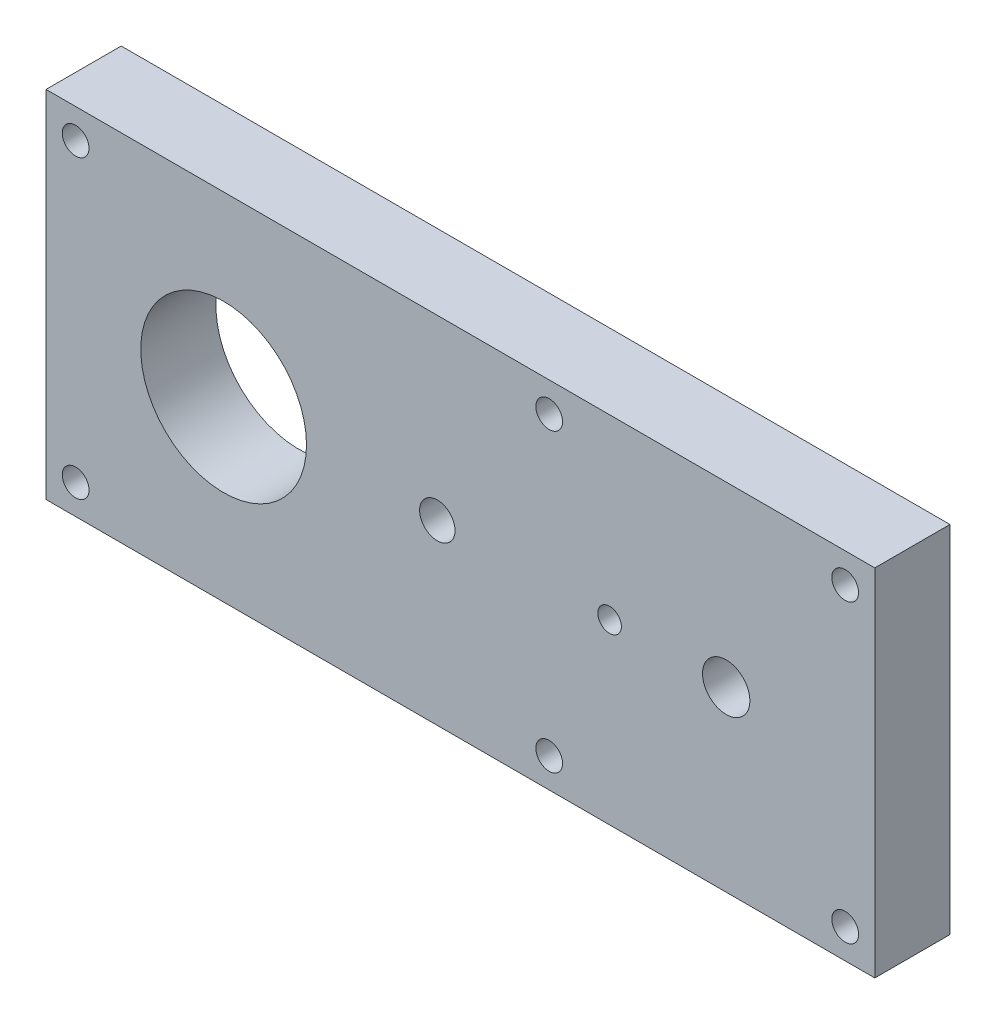
ISO-10303-21;
HEADER;
FILE_DESCRIPTION(('STEP AP214'),'2;1');
FILE_NAME('part.step','',(''),(''),'','','');
FILE_SCHEMA(('AUTOMOTIVE_DESIGN { 1 0 10303 214 1 1 1 1 }'));
ENDSEC;
DATA;
#1=APPLICATION_CONTEXT('core data for automotive mechanical design processes');
#2=APPLICATION_PROTOCOL_DEFINITION('international standard','automotive_design',2000,#1);
#3=PRODUCT_CONTEXT('',#1,'mechanical');
#4=PRODUCT('Part','Part','',(#3));
#5=PRODUCT_RELATED_PRODUCT_CATEGORY('part','',(#4));
#6=PRODUCT_DEFINITION_FORMATION('','',#4);
#7=PRODUCT_DEFINITION_CONTEXT('part definition',#1,'design');
#8=PRODUCT_DEFINITION('design','',#6,#7);
#9=PRODUCT_DEFINITION_SHAPE('','',#8);
#10=(LENGTH_UNIT() NAMED_UNIT(*) SI_UNIT(.MILLI.,.METRE.));
#11=(NAMED_UNIT(*) PLANE_ANGLE_UNIT() SI_UNIT($,.RADIAN.));
#12=(NAMED_UNIT(*) SI_UNIT($,.STERADIAN.) SOLID_ANGLE_UNIT());
#13=UNCERTAINTY_MEASURE_WITH_UNIT(LENGTH_MEASURE(1.E-05),#10,'distance_accuracy_value','');
#14=(GEOMETRIC_REPRESENTATION_CONTEXT(3) GLOBAL_UNCERTAINTY_ASSIGNED_CONTEXT((#13)) GLOBAL_UNIT_ASSIGNED_CONTEXT((#10,
#11,#12)) REPRESENTATION_CONTEXT('',''));
#15=CARTESIAN_POINT('',(0.,0.,0.));
#16=DIRECTION('',(0.,0.,1.));
#17=DIRECTION('',(1.,0.,0.));
#18=AXIS2_PLACEMENT_3D('',#15,#16,#17);
#19=CARTESIAN_POINT('',(0.,0.,6.35));
#20=DIRECTION('',(0.,0.,1.));
#21=DIRECTION('',(1.,0.,0.));
#22=AXIS2_PLACEMENT_3D('',#19,#20,#21);
#23=PLANE('',#22);
#24=CARTESIAN_POINT('',(-12.5,12.5,6.35));
#25=DIRECTION('',(0.,0.,1.));
#26=DIRECTION('',(1.,0.,0.));
#27=AXIS2_PLACEMENT_3D('',#24,#25,#26);
#28=CIRCLE('',#27,1.1303);
#29=CARTESIAN_POINT('',(-11.3697,12.5,6.35));
#30=VERTEX_POINT('',#29);
#31=EDGE_CURVE('E171',#30,#30,#28,.T.);
#32=ORIENTED_EDGE('',*,*,#31,.F.);
#33=EDGE_LOOP('',(#32));
#34=FACE_BOUND('',#33,.T.);
#35=CARTESIAN_POINT('',(-12.5,-12.5,6.35));
#36=DIRECTION('',(0.,0.,1.));
#37=DIRECTION('',(1.,0.,0.));
#38=AXIS2_PLACEMENT_3D('',#35,#36,#37);
#39=CIRCLE('',#38,1.1303);
#40=CARTESIAN_POINT('',(-11.3697,-12.5,6.35));
#41=VERTEX_POINT('',#40);
#42=EDGE_CURVE('E165',#41,#41,#39,.T.);
#43=ORIENTED_EDGE('',*,*,#42,.F.);
#44=EDGE_LOOP('',(#43));
#45=FACE_BOUND('',#44,.T.);
#46=CARTESIAN_POINT('',(27.5,12.5,6.35));
#47=DIRECTION('',(0.,0.,1.));
#48=DIRECTION('',(1.,0.,0.));
#49=AXIS2_PLACEMENT_3D('',#46,#47,#48);
#50=CIRCLE('',#49,1.1303);
#51=CARTESIAN_POINT('',(28.6303,12.5,6.35));
#52=VERTEX_POINT('',#51);
#53=EDGE_CURVE('E159',#52,#52,#50,.T.);
#54=ORIENTED_EDGE('',*,*,#53,.F.);
#55=EDGE_LOOP('',(#54));
#56=FACE_BOUND('',#55,.T.);
#57=CARTESIAN_POINT('',(27.5,-12.5,6.35));
#58=DIRECTION('',(0.,0.,1.));
#59=DIRECTION('',(1.,0.,0.));
#60=AXIS2_PLACEMENT_3D('',#57,#58,#59);
#61=CIRCLE('',#60,1.1303);
#62=CARTESIAN_POINT('',(28.6303,-12.5,6.35));
#63=VERTEX_POINT('',#62);
#64=EDGE_CURVE('E153',#63,#63,#61,.T.);
#65=ORIENTED_EDGE('',*,*,#64,.F.);
#66=EDGE_LOOP('',(#65));
#67=FACE_BOUND('',#66,.T.);
#68=CARTESIAN_POINT('',(52.5,12.5,6.35));
#69=DIRECTION('',(0.,0.,1.));
#70=DIRECTION('',(1.,0.,0.));
#71=AXIS2_PLACEMENT_3D('',#68,#69,#70);
#72=CIRCLE('',#71,1.1303);
#73=CARTESIAN_POINT('',(53.6303,12.5,6.35));
#74=VERTEX_POINT('',#73);
#75=EDGE_CURVE('E147',#74,#74,#72,.T.);
#76=ORIENTED_EDGE('',*,*,#75,.F.);
#77=EDGE_LOOP('',(#76));
#78=FACE_BOUND('',#77,.T.);
#79=CARTESIAN_POINT('',(52.5,-12.5,6.35));
#80=DIRECTION('',(0.,0.,1.));
#81=DIRECTION('',(1.,0.,0.));
#82=AXIS2_PLACEMENT_3D('',#79,#80,#81);
#83=CIRCLE('',#82,1.1303);
#84=CARTESIAN_POINT('',(53.6303,-12.5,6.35));
#85=VERTEX_POINT('',#84);
#86=EDGE_CURVE('E141',#85,#85,#83,.T.);
#87=ORIENTED_EDGE('',*,*,#86,.F.);
#88=EDGE_LOOP('',(#87));
#89=FACE_BOUND('',#88,.T.);
#90=CARTESIAN_POINT('',(32.6,0.,6.35));
#91=DIRECTION('',(0.,0.,1.));
#92=DIRECTION('',(1.,0.,0.));
#93=AXIS2_PLACEMENT_3D('',#90,#91,#92);
#94=CIRCLE('',#93,0.995);
#95=CARTESIAN_POINT('',(33.595,0.,6.35));
#96=VERTEX_POINT('',#95);
#97=EDGE_CURVE('E124',#96,#96,#94,.T.);
#98=ORIENTED_EDGE('',*,*,#97,.F.);
#99=EDGE_LOOP('',(#98));
#100=FACE_BOUND('',#99,.T.);
#101=CARTESIAN_POINT('',(0.,0.,6.35));
#102=DIRECTION('',(0.,0.,1.));
#103=DIRECTION('',(1.,0.,0.));
#104=AXIS2_PLACEMENT_3D('',#101,#102,#103);
#105=CIRCLE('',#104,7.);
#106=CARTESIAN_POINT('',(7.,0.,6.35));
#107=VERTEX_POINT('',#106);
#108=EDGE_CURVE('E103',#107,#107,#105,.T.);
#109=ORIENTED_EDGE('',*,*,#108,.F.);
#110=EDGE_LOOP('',(#109));
#111=FACE_BOUND('',#110,.T.);
#112=DIRECTION('',(0.,-1.,0.));
#113=VECTOR('',#112,1.);
#114=CARTESIAN_POINT('',(-15.,15.,6.35));
#115=LINE('',#114,#113);
#116=CARTESIAN_POINT('',(-15.,15.,6.35));
#117=VERTEX_POINT('',#116);
#118=CARTESIAN_POINT('',(-15.,-15.,6.35));
#119=VERTEX_POINT('',#118);
#120=EDGE_CURVE('E88',#117,#119,#115,.T.);
#121=ORIENTED_EDGE('',*,*,#120,.T.);
#122=DIRECTION('',(1.,0.,0.));
#123=VECTOR('',#122,1.);
#124=CARTESIAN_POINT('',(-15.,-15.,6.35));
#125=LINE('',#124,#123);
#126=CARTESIAN_POINT('',(55.,-15.,6.35));
#127=VERTEX_POINT('',#126);
#128=EDGE_CURVE('E83',#119,#127,#125,.T.);
#129=ORIENTED_EDGE('',*,*,#128,.T.);
#130=DIRECTION('',(0.,1.,0.));
#131=VECTOR('',#130,1.);
#132=CARTESIAN_POINT('',(55.,15.,6.35));
#133=LINE('',#132,#131);
#134=CARTESIAN_POINT('',(55.,15.,6.35));
#135=VERTEX_POINT('',#134);
#136=EDGE_CURVE('E86',#127,#135,#133,.T.);
#137=ORIENTED_EDGE('',*,*,#136,.T.);
#138=DIRECTION('',(-1.,0.,0.));
#139=VECTOR('',#138,1.);
#140=CARTESIAN_POINT('',(-15.,15.,6.35));
#141=LINE('',#140,#139);
#142=EDGE_CURVE('E53',#135,#117,#141,.T.);
#143=ORIENTED_EDGE('',*,*,#142,.T.);
#144=EDGE_LOOP('',(#121,#129,#137,#143));
#145=FACE_BOUND('',#144,.T.);
#146=CARTESIAN_POINT('',(18.05,0.,6.35));
#147=DIRECTION('',(0.,0.,1.));
#148=DIRECTION('',(1.,0.,0.));
#149=AXIS2_PLACEMENT_3D('',#146,#147,#148);
#150=CIRCLE('',#149,1.495);
#151=CARTESIAN_POINT('',(19.545,0.,6.35));
#152=VERTEX_POINT('',#151);
#153=EDGE_CURVE('E118',#152,#152,#150,.T.);
#154=ORIENTED_EDGE('',*,*,#153,.F.);
#155=EDGE_LOOP('',(#154));
#156=FACE_BOUND('',#155,.T.);
#157=CARTESIAN_POINT('',(42.449999958,0.,6.35));
#158=DIRECTION('',(0.,0.,1.));
#159=DIRECTION('',(1.,0.,0.));
#160=AXIS2_PLACEMENT_3D('',#157,#158,#159);
#161=CIRCLE('',#160,2.);
#162=CARTESIAN_POINT('',(44.449999958,0.,6.35));
#163=VERTEX_POINT('',#162);
#164=EDGE_CURVE('E130',#163,#163,#161,.T.);
#165=ORIENTED_EDGE('',*,*,#164,.F.);
#166=EDGE_LOOP('',(#165));
#167=FACE_BOUND('',#166,.T.);
#168=ADVANCED_FACE('F36',(#34,#45,#56,#67,#78,#89,#100,#111,#145,#156,#167),#23,.T.);
#169=CARTESIAN_POINT('',(0.,0.,0.));
#170=DIRECTION('',(0.,0.,1.));
#171=DIRECTION('',(1.,0.,0.));
#172=AXIS2_PLACEMENT_3D('',#169,#170,#171);
#173=PLANE('',#172);
#174=CARTESIAN_POINT('',(-12.5,12.5,0.));
#175=DIRECTION('',(0.,0.,1.));
#176=DIRECTION('',(1.,0.,0.));
#177=AXIS2_PLACEMENT_3D('',#174,#175,#176);
#178=CIRCLE('',#177,1.1303);
#179=CARTESIAN_POINT('',(-11.3697,12.5,0.));
#180=VERTEX_POINT('',#179);
#181=EDGE_CURVE('E168',#180,#180,#178,.T.);
#182=ORIENTED_EDGE('',*,*,#181,.T.);
#183=EDGE_LOOP('',(#182));
#184=FACE_BOUND('',#183,.T.);
#185=CARTESIAN_POINT('',(-12.5,-12.5,0.));
#186=DIRECTION('',(0.,0.,1.));
#187=DIRECTION('',(1.,0.,0.));
#188=AXIS2_PLACEMENT_3D('',#185,#186,#187);
#189=CIRCLE('',#188,1.1303);
#190=CARTESIAN_POINT('',(-11.3697,-12.5,0.));
#191=VERTEX_POINT('',#190);
#192=EDGE_CURVE('E162',#191,#191,#189,.T.);
#193=ORIENTED_EDGE('',*,*,#192,.T.);
#194=EDGE_LOOP('',(#193));
#195=FACE_BOUND('',#194,.T.);
#196=CARTESIAN_POINT('',(27.5,12.5,0.));
#197=DIRECTION('',(0.,0.,1.));
#198=DIRECTION('',(1.,0.,0.));
#199=AXIS2_PLACEMENT_3D('',#196,#197,#198);
#200=CIRCLE('',#199,1.1303);
#201=CARTESIAN_POINT('',(28.6303,12.5,0.));
#202=VERTEX_POINT('',#201);
#203=EDGE_CURVE('E156',#202,#202,#200,.T.);
#204=ORIENTED_EDGE('',*,*,#203,.T.);
#205=EDGE_LOOP('',(#204));
#206=FACE_BOUND('',#205,.T.);
#207=CARTESIAN_POINT('',(27.5,-12.5,0.));
#208=DIRECTION('',(0.,0.,1.));
#209=DIRECTION('',(1.,0.,0.));
#210=AXIS2_PLACEMENT_3D('',#207,#208,#209);
#211=CIRCLE('',#210,1.1303);
#212=CARTESIAN_POINT('',(28.6303,-12.5,0.));
#213=VERTEX_POINT('',#212);
#214=EDGE_CURVE('E150',#213,#213,#211,.T.);
#215=ORIENTED_EDGE('',*,*,#214,.T.);
#216=EDGE_LOOP('',(#215));
#217=FACE_BOUND('',#216,.T.);
#218=CARTESIAN_POINT('',(52.5,12.5,0.));
#219=DIRECTION('',(0.,0.,1.));
#220=DIRECTION('',(1.,0.,0.));
#221=AXIS2_PLACEMENT_3D('',#218,#219,#220);
#222=CIRCLE('',#221,1.1303);
#223=CARTESIAN_POINT('',(53.6303,12.5,0.));
#224=VERTEX_POINT('',#223);
#225=EDGE_CURVE('E144',#224,#224,#222,.T.);
#226=ORIENTED_EDGE('',*,*,#225,.T.);
#227=EDGE_LOOP('',(#226));
#228=FACE_BOUND('',#227,.T.);
#229=CARTESIAN_POINT('',(52.5,-12.5,0.));
#230=DIRECTION('',(0.,0.,1.));
#231=DIRECTION('',(1.,0.,0.));
#232=AXIS2_PLACEMENT_3D('',#229,#230,#231);
#233=CIRCLE('',#232,1.1303);
#234=CARTESIAN_POINT('',(53.6303,-12.5,0.));
#235=VERTEX_POINT('',#234);
#236=EDGE_CURVE('E136',#235,#235,#233,.T.);
#237=ORIENTED_EDGE('',*,*,#236,.T.);
#238=EDGE_LOOP('',(#237));
#239=FACE_BOUND('',#238,.T.);
#240=CARTESIAN_POINT('',(32.6,0.,0.));
#241=DIRECTION('',(0.,0.,1.));
#242=DIRECTION('',(1.,0.,0.));
#243=AXIS2_PLACEMENT_3D('',#240,#241,#242);
#244=CIRCLE('',#243,0.995);
#245=CARTESIAN_POINT('',(33.595,0.,0.));
#246=VERTEX_POINT('',#245);
#247=EDGE_CURVE('E127',#246,#246,#244,.T.);
#248=ORIENTED_EDGE('',*,*,#247,.T.);
#249=EDGE_LOOP('',(#248));
#250=FACE_BOUND('',#249,.T.);
#251=CARTESIAN_POINT('',(0.,0.,0.));
#252=DIRECTION('',(0.,0.,1.));
#253=DIRECTION('',(1.,0.,0.));
#254=AXIS2_PLACEMENT_3D('',#251,#252,#253);
#255=CIRCLE('',#254,7.);
#256=CARTESIAN_POINT('',(7.,0.,0.));
#257=VERTEX_POINT('',#256);
#258=EDGE_CURVE('E115',#257,#257,#255,.T.);
#259=ORIENTED_EDGE('',*,*,#258,.T.);
#260=EDGE_LOOP('',(#259));
#261=FACE_BOUND('',#260,.T.);
#262=DIRECTION('',(0.,-1.,0.));
#263=VECTOR('',#262,1.);
#264=CARTESIAN_POINT('',(-15.,15.,0.));
#265=LINE('',#264,#263);
#266=CARTESIAN_POINT('',(-15.,15.,0.));
#267=VERTEX_POINT('',#266);
#268=CARTESIAN_POINT('',(-15.,-15.,0.));
#269=VERTEX_POINT('',#268);
#270=EDGE_CURVE('E100',#267,#269,#265,.T.);
#271=ORIENTED_EDGE('',*,*,#270,.F.);
#272=DIRECTION('',(-1.,0.,0.));
#273=VECTOR('',#272,1.);
#274=CARTESIAN_POINT('',(-15.,15.,0.));
#275=LINE('',#274,#273);
#276=CARTESIAN_POINT('',(55.,15.,0.));
#277=VERTEX_POINT('',#276);
#278=EDGE_CURVE('E76',#277,#267,#275,.T.);
#279=ORIENTED_EDGE('',*,*,#278,.F.);
#280=DIRECTION('',(0.,1.,0.));
#281=VECTOR('',#280,1.);
#282=CARTESIAN_POINT('',(55.,15.,0.));
#283=LINE('',#282,#281);
#284=CARTESIAN_POINT('',(55.,-15.,0.));
#285=VERTEX_POINT('',#284);
#286=EDGE_CURVE('E70',#285,#277,#283,.T.);
#287=ORIENTED_EDGE('',*,*,#286,.F.);
#288=DIRECTION('',(1.,0.,0.));
#289=VECTOR('',#288,1.);
#290=CARTESIAN_POINT('',(-15.,-15.,0.));
#291=LINE('',#290,#289);
#292=EDGE_CURVE('E92',#269,#285,#291,.T.);
#293=ORIENTED_EDGE('',*,*,#292,.F.);
#294=EDGE_LOOP('',(#271,#279,#287,#293));
#295=FACE_BOUND('',#294,.T.);
#296=CARTESIAN_POINT('',(18.05,0.,0.));
#297=DIRECTION('',(0.,0.,1.));
#298=DIRECTION('',(1.,0.,0.));
#299=AXIS2_PLACEMENT_3D('',#296,#297,#298);
#300=CIRCLE('',#299,1.495);
#301=CARTESIAN_POINT('',(19.545,0.,0.));
#302=VERTEX_POINT('',#301);
#303=EDGE_CURVE('E121',#302,#302,#300,.T.);
#304=ORIENTED_EDGE('',*,*,#303,.T.);
#305=EDGE_LOOP('',(#304));
#306=FACE_BOUND('',#305,.T.);
#307=CARTESIAN_POINT('',(42.449999958,0.,0.));
#308=DIRECTION('',(0.,0.,1.));
#309=DIRECTION('',(1.,0.,0.));
#310=AXIS2_PLACEMENT_3D('',#307,#308,#309);
#311=CIRCLE('',#310,2.);
#312=CARTESIAN_POINT('',(44.449999958,0.,0.));
#313=VERTEX_POINT('',#312);
#314=EDGE_CURVE('E133',#313,#313,#311,.T.);
#315=ORIENTED_EDGE('',*,*,#314,.T.);
#316=EDGE_LOOP('',(#315));
#317=FACE_BOUND('',#316,.T.);
#318=ADVANCED_FACE('F111',(#184,#195,#206,#217,#228,#239,#250,#261,#295,#306,#317),#173,.F.);
#319=CARTESIAN_POINT('',(-15.,15.,6.35));
#320=DIRECTION('',(1.,0.,0.));
#321=DIRECTION('',(0.,1.,0.));
#322=AXIS2_PLACEMENT_3D('',#319,#320,#321);
#323=PLANE('',#322);
#324=ORIENTED_EDGE('',*,*,#270,.T.);
#325=DIRECTION('',(0.,0.,-1.));
#326=VECTOR('',#325,1.);
#327=CARTESIAN_POINT('',(-15.,-15.,6.35));
#328=LINE('',#327,#326);
#329=EDGE_CURVE('E11',#119,#269,#328,.T.);
#330=ORIENTED_EDGE('',*,*,#329,.F.);
#331=ORIENTED_EDGE('',*,*,#120,.F.);
#332=DIRECTION('',(0.,0.,-1.));
#333=VECTOR('',#332,1.);
#334=CARTESIAN_POINT('',(-15.,15.,6.35));
#335=LINE('',#334,#333);
#336=EDGE_CURVE('E96',#117,#267,#335,.T.);
#337=ORIENTED_EDGE('',*,*,#336,.T.);
#338=EDGE_LOOP('',(#324,#330,#331,#337));
#339=FACE_BOUND('',#338,.T.);
#340=ADVANCED_FACE('F38',(#339),#323,.F.);
#341=CARTESIAN_POINT('',(-15.,-15.,6.35));
#342=DIRECTION('',(0.,1.,0.));
#343=DIRECTION('',(-1.,0.,0.));
#344=AXIS2_PLACEMENT_3D('',#341,#342,#343);
#345=PLANE('',#344);
#346=ORIENTED_EDGE('',*,*,#292,.T.);
#347=DIRECTION('',(0.,0.,-1.));
#348=VECTOR('',#347,1.);
#349=CARTESIAN_POINT('',(55.,-15.,6.35));
#350=LINE('',#349,#348);
#351=EDGE_CURVE('E45',#127,#285,#350,.T.);
#352=ORIENTED_EDGE('',*,*,#351,.F.);
#353=ORIENTED_EDGE('',*,*,#128,.F.);
#354=ORIENTED_EDGE('',*,*,#329,.T.);
#355=EDGE_LOOP('',(#346,#352,#353,#354));
#356=FACE_BOUND('',#355,.T.);
#357=ADVANCED_FACE('F91',(#356),#345,.F.);
#358=CARTESIAN_POINT('',(55.,15.,6.35));
#359=DIRECTION('',(-1.,0.,0.));
#360=DIRECTION('',(0.,-1.,0.));
#361=AXIS2_PLACEMENT_3D('',#358,#359,#360);
#362=PLANE('',#361);
#363=ORIENTED_EDGE('',*,*,#286,.T.);
#364=DIRECTION('',(0.,0.,-1.));
#365=VECTOR('',#364,1.);
#366=CARTESIAN_POINT('',(55.,15.,6.35));
#367=LINE('',#366,#365);
#368=EDGE_CURVE('E93',#135,#277,#367,.T.);
#369=ORIENTED_EDGE('',*,*,#368,.F.);
#370=ORIENTED_EDGE('',*,*,#136,.F.);
#371=ORIENTED_EDGE('',*,*,#351,.T.);
#372=EDGE_LOOP('',(#363,#369,#370,#371));
#373=FACE_BOUND('',#372,.T.);
#374=ADVANCED_FACE('F94',(#373),#362,.F.);
#375=CARTESIAN_POINT('',(-15.,15.,6.35));
#376=DIRECTION('',(0.,-1.,0.));
#377=DIRECTION('',(1.,0.,0.));
#378=AXIS2_PLACEMENT_3D('',#375,#376,#377);
#379=PLANE('',#378);
#380=ORIENTED_EDGE('',*,*,#278,.T.);
#381=ORIENTED_EDGE('',*,*,#336,.F.);
#382=ORIENTED_EDGE('',*,*,#142,.F.);
#383=ORIENTED_EDGE('',*,*,#368,.T.);
#384=EDGE_LOOP('',(#380,#381,#382,#383));
#385=FACE_BOUND('',#384,.T.);
#386=ADVANCED_FACE('F108',(#385),#379,.F.);
#387=CARTESIAN_POINT('',(0.,0.,6.35));
#388=DIRECTION('',(0.,0.,-1.));
#389=DIRECTION('',(-1.,0.,0.));
#390=AXIS2_PLACEMENT_3D('',#387,#388,#389);
#391=CYLINDRICAL_SURFACE('',#390,7.);
#392=ORIENTED_EDGE('',*,*,#108,.T.);
#393=EDGE_LOOP('',(#392));
#394=FACE_BOUND('',#393,.T.);
#395=ORIENTED_EDGE('',*,*,#258,.F.);
#396=EDGE_LOOP('',(#395));
#397=FACE_BOUND('',#396,.T.);
#398=ADVANCED_FACE('F194',(#394,#397),#391,.F.);
#399=CARTESIAN_POINT('',(18.05,0.,6.35));
#400=DIRECTION('',(0.,0.,-1.));
#401=DIRECTION('',(-1.,0.,0.));
#402=AXIS2_PLACEMENT_3D('',#399,#400,#401);
#403=CYLINDRICAL_SURFACE('',#402,1.495);
#404=ORIENTED_EDGE('',*,*,#153,.T.);
#405=EDGE_LOOP('',(#404));
#406=FACE_BOUND('',#405,.T.);
#407=ORIENTED_EDGE('',*,*,#303,.F.);
#408=EDGE_LOOP('',(#407));
#409=FACE_BOUND('',#408,.T.);
#410=ADVANCED_FACE('F197',(#406,#409),#403,.F.);
#411=CARTESIAN_POINT('',(32.6,0.,6.35));
#412=DIRECTION('',(0.,0.,-1.));
#413=DIRECTION('',(-1.,0.,0.));
#414=AXIS2_PLACEMENT_3D('',#411,#412,#413);
#415=CYLINDRICAL_SURFACE('',#414,0.995);
#416=ORIENTED_EDGE('',*,*,#97,.T.);
#417=EDGE_LOOP('',(#416));
#418=FACE_BOUND('',#417,.T.);
#419=ORIENTED_EDGE('',*,*,#247,.F.);
#420=EDGE_LOOP('',(#419));
#421=FACE_BOUND('',#420,.T.);
#422=ADVANCED_FACE('F235',(#418,#421),#415,.F.);
#423=CARTESIAN_POINT('',(42.449999958,0.,6.35));
#424=DIRECTION('',(0.,0.,-1.));
#425=DIRECTION('',(-1.,0.,0.));
#426=AXIS2_PLACEMENT_3D('',#423,#424,#425);
#427=CYLINDRICAL_SURFACE('',#426,2.);
#428=ORIENTED_EDGE('',*,*,#164,.T.);
#429=EDGE_LOOP('',(#428));
#430=FACE_BOUND('',#429,.T.);
#431=ORIENTED_EDGE('',*,*,#314,.F.);
#432=EDGE_LOOP('',(#431));
#433=FACE_BOUND('',#432,.T.);
#434=ADVANCED_FACE('F243',(#430,#433),#427,.F.);
#435=CARTESIAN_POINT('',(52.5,-12.5,6.35));
#436=DIRECTION('',(0.,0.,1.));
#437=DIRECTION('',(1.,0.,0.));
#438=AXIS2_PLACEMENT_3D('',#435,#436,#437);
#439=CYLINDRICAL_SURFACE('',#438,1.1303);
#440=ORIENTED_EDGE('',*,*,#236,.F.);
#441=EDGE_LOOP('',(#440));
#442=FACE_BOUND('',#441,.T.);
#443=ORIENTED_EDGE('',*,*,#86,.T.);
#444=EDGE_LOOP('',(#443));
#445=FACE_BOUND('',#444,.T.);
#446=ADVANCED_FACE('F251',(#442,#445),#439,.F.);
#447=CARTESIAN_POINT('',(52.5,12.5,6.35));
#448=DIRECTION('',(0.,0.,1.));
#449=DIRECTION('',(1.,0.,0.));
#450=AXIS2_PLACEMENT_3D('',#447,#448,#449);
#451=CYLINDRICAL_SURFACE('',#450,1.1303);
#452=ORIENTED_EDGE('',*,*,#225,.F.);
#453=EDGE_LOOP('',(#452));
#454=FACE_BOUND('',#453,.T.);
#455=ORIENTED_EDGE('',*,*,#75,.T.);
#456=EDGE_LOOP('',(#455));
#457=FACE_BOUND('',#456,.T.);
#458=ADVANCED_FACE('F260',(#454,#457),#451,.F.);
#459=CARTESIAN_POINT('',(27.5,-12.5,6.35));
#460=DIRECTION('',(0.,0.,1.));
#461=DIRECTION('',(1.,0.,0.));
#462=AXIS2_PLACEMENT_3D('',#459,#460,#461);
#463=CYLINDRICAL_SURFACE('',#462,1.1303);
#464=ORIENTED_EDGE('',*,*,#214,.F.);
#465=EDGE_LOOP('',(#464));
#466=FACE_BOUND('',#465,.T.);
#467=ORIENTED_EDGE('',*,*,#64,.T.);
#468=EDGE_LOOP('',(#467));
#469=FACE_BOUND('',#468,.T.);
#470=ADVANCED_FACE('F268',(#466,#469),#463,.F.);
#471=CARTESIAN_POINT('',(27.5,12.5,6.35));
#472=DIRECTION('',(0.,0.,1.));
#473=DIRECTION('',(1.,0.,0.));
#474=AXIS2_PLACEMENT_3D('',#471,#472,#473);
#475=CYLINDRICAL_SURFACE('',#474,1.1303);
#476=ORIENTED_EDGE('',*,*,#203,.F.);
#477=EDGE_LOOP('',(#476));
#478=FACE_BOUND('',#477,.T.);
#479=ORIENTED_EDGE('',*,*,#53,.T.);
#480=EDGE_LOOP('',(#479));
#481=FACE_BOUND('',#480,.T.);
#482=ADVANCED_FACE('F276',(#478,#481),#475,.F.);
#483=CARTESIAN_POINT('',(-12.5,-12.5,6.35));
#484=DIRECTION('',(0.,0.,1.));
#485=DIRECTION('',(1.,0.,0.));
#486=AXIS2_PLACEMENT_3D('',#483,#484,#485);
#487=CYLINDRICAL_SURFACE('',#486,1.1303);
#488=ORIENTED_EDGE('',*,*,#192,.F.);
#489=EDGE_LOOP('',(#488));
#490=FACE_BOUND('',#489,.T.);
#491=ORIENTED_EDGE('',*,*,#42,.T.);
#492=EDGE_LOOP('',(#491));
#493=FACE_BOUND('',#492,.T.);
#494=ADVANCED_FACE('F284',(#490,#493),#487,.F.);
#495=CARTESIAN_POINT('',(-12.5,12.5,6.35));
#496=DIRECTION('',(0.,0.,1.));
#497=DIRECTION('',(1.,0.,0.));
#498=AXIS2_PLACEMENT_3D('',#495,#496,#497);
#499=CYLINDRICAL_SURFACE('',#498,1.1303);
#500=ORIENTED_EDGE('',*,*,#181,.F.);
#501=EDGE_LOOP('',(#500));
#502=FACE_BOUND('',#501,.T.);
#503=ORIENTED_EDGE('',*,*,#31,.T.);
#504=EDGE_LOOP('',(#503));
#505=FACE_BOUND('',#504,.T.);
#506=ADVANCED_FACE('F175',(#502,#505),#499,.F.);
#507=CLOSED_SHELL('',(#168,#318,#340,#357,#374,#386,#398,#410,#422,#434,#446,#458,#470,#482,
#494,#506));
#508=MANIFOLD_SOLID_BREP('B2',#507);
#509=ADVANCED_BREP_SHAPE_REPRESENTATION('',(#18,#508),#14);
#510=SHAPE_DEFINITION_REPRESENTATION(#9,#509);
ENDSEC;
END-ISO-10303-21;
